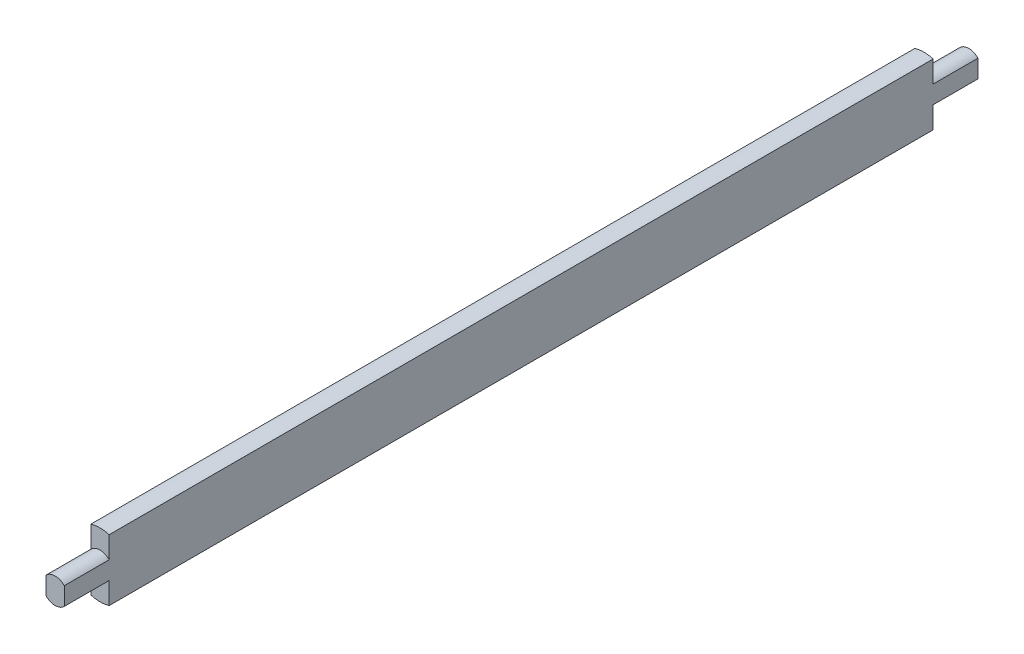
ISO-10303-21;
HEADER;
FILE_DESCRIPTION(('STEP AP214'),'2;1');
FILE_NAME('part.step','',(''),(''),'','','');
FILE_SCHEMA(('AUTOMOTIVE_DESIGN { 1 0 10303 214 1 1 1 1 }'));
ENDSEC;
DATA;
#1=APPLICATION_CONTEXT('core data for automotive mechanical design processes');
#2=APPLICATION_PROTOCOL_DEFINITION('international standard','automotive_design',2000,#1);
#3=PRODUCT_CONTEXT('',#1,'mechanical');
#4=PRODUCT('Part','Part','',(#3));
#5=PRODUCT_RELATED_PRODUCT_CATEGORY('part','',(#4));
#6=PRODUCT_DEFINITION_FORMATION('','',#4);
#7=PRODUCT_DEFINITION_CONTEXT('part definition',#1,'design');
#8=PRODUCT_DEFINITION('design','',#6,#7);
#9=PRODUCT_DEFINITION_SHAPE('','',#8);
#10=(LENGTH_UNIT() NAMED_UNIT(*) SI_UNIT(.MILLI.,.METRE.));
#11=(NAMED_UNIT(*) PLANE_ANGLE_UNIT() SI_UNIT($,.RADIAN.));
#12=(NAMED_UNIT(*) SI_UNIT($,.STERADIAN.) SOLID_ANGLE_UNIT());
#13=UNCERTAINTY_MEASURE_WITH_UNIT(LENGTH_MEASURE(1.E-05),#10,'distance_accuracy_value','');
#14=(GEOMETRIC_REPRESENTATION_CONTEXT(3) GLOBAL_UNCERTAINTY_ASSIGNED_CONTEXT((#13)) GLOBAL_UNIT_ASSIGNED_CONTEXT((#10,
#11,#12)) REPRESENTATION_CONTEXT('',''));
#15=CARTESIAN_POINT('',(0.,0.,0.));
#16=DIRECTION('',(0.,0.,1.));
#17=DIRECTION('',(1.,0.,0.));
#18=AXIS2_PLACEMENT_3D('',#15,#16,#17);
#19=CARTESIAN_POINT('',(0.,0.,90.));
#20=DIRECTION('',(0.,0.,-1.));
#21=DIRECTION('',(-1.,0.,0.));
#22=AXIS2_PLACEMENT_3D('',#19,#20,#21);
#23=CYLINDRICAL_SURFACE('',#22,3.5);
#24=CARTESIAN_POINT('',(0.,0.,90.));
#25=DIRECTION('',(0.,0.,1.));
#26=DIRECTION('',(1.,0.,0.));
#27=AXIS2_PLACEMENT_3D('',#24,#25,#26);
#28=CIRCLE('',#27,3.5);
#29=CARTESIAN_POINT('',(-0.999999999999999,-3.35410196624968,90.));
#30=VERTEX_POINT('',#29);
#31=CARTESIAN_POINT('',(1.,-3.35410196624968,90.));
#32=VERTEX_POINT('',#31);
#33=EDGE_CURVE('E162',#30,#32,#28,.T.);
#34=ORIENTED_EDGE('',*,*,#33,.F.);
#35=DIRECTION('',(0.,0.,-1.));
#36=VECTOR('',#35,1.);
#37=CARTESIAN_POINT('',(-0.999999999999999,-3.35410196624968,90.));
#38=LINE('',#37,#36);
#39=CARTESIAN_POINT('',(-0.999999999999999,-3.35410196624969,0.));
#40=VERTEX_POINT('',#39);
#41=EDGE_CURVE('E225',#30,#40,#38,.T.);
#42=ORIENTED_EDGE('',*,*,#41,.T.);
#43=CARTESIAN_POINT('',(0.,0.,0.));
#44=DIRECTION('',(0.,0.,1.));
#45=DIRECTION('',(1.,0.,0.));
#46=AXIS2_PLACEMENT_3D('',#43,#44,#45);
#47=CIRCLE('',#46,3.5);
#48=CARTESIAN_POINT('',(1.,-3.35410196624968,0.));
#49=VERTEX_POINT('',#48);
#50=EDGE_CURVE('E147',#40,#49,#47,.T.);
#51=ORIENTED_EDGE('',*,*,#50,.T.);
#52=DIRECTION('',(0.,0.,-1.));
#53=VECTOR('',#52,1.);
#54=CARTESIAN_POINT('',(1.,-3.35410196624968,90.));
#55=LINE('',#54,#53);
#56=EDGE_CURVE('E193',#49,#32,#55,.F.);
#57=ORIENTED_EDGE('',*,*,#56,.T.);
#58=EDGE_LOOP('',(#34,#42,#51,#57));
#59=FACE_BOUND('',#58,.T.);
#60=ADVANCED_FACE('F33',(#59),#23,.T.);
#61=CARTESIAN_POINT('',(0.,0.,90.));
#62=DIRECTION('',(0.,0.,1.));
#63=DIRECTION('',(1.,0.,0.));
#64=AXIS2_PLACEMENT_3D('',#61,#62,#63);
#65=PLANE('',#64);
#66=DIRECTION('',(0.,1.,0.));
#67=VECTOR('',#66,1.);
#68=CARTESIAN_POINT('',(-0.999999999999999,0.,90.));
#69=LINE('',#68,#67);
#70=CARTESIAN_POINT('',(-0.999999999999999,-0.979795897113272,90.));
#71=VERTEX_POINT('',#70);
#72=EDGE_CURVE('E126',#30,#71,#69,.T.);
#73=ORIENTED_EDGE('',*,*,#72,.F.);
#74=ORIENTED_EDGE('',*,*,#33,.T.);
#75=DIRECTION('',(0.,-1.,0.));
#76=VECTOR('',#75,1.);
#77=CARTESIAN_POINT('',(1.,0.,90.));
#78=LINE('',#77,#76);
#79=CARTESIAN_POINT('',(1.,-0.97979589711327,90.));
#80=VERTEX_POINT('',#79);
#81=EDGE_CURVE('E197',#80,#32,#78,.T.);
#82=ORIENTED_EDGE('',*,*,#81,.F.);
#83=CARTESIAN_POINT('',(0.,0.,90.));
#84=DIRECTION('',(0.,0.,1.));
#85=DIRECTION('',(1.,0.,0.));
#86=AXIS2_PLACEMENT_3D('',#83,#84,#85);
#87=CIRCLE('',#86,1.4);
#88=EDGE_CURVE('E158',#71,#80,#87,.T.);
#89=ORIENTED_EDGE('',*,*,#88,.F.);
#90=EDGE_LOOP('',(#73,#74,#82,#89));
#91=FACE_BOUND('',#90,.T.);
#92=ADVANCED_FACE('F245',(#91),#65,.T.);
#93=CARTESIAN_POINT('',(0.,0.,0.));
#94=DIRECTION('',(0.,0.,1.));
#95=DIRECTION('',(1.,0.,0.));
#96=AXIS2_PLACEMENT_3D('',#93,#94,#95);
#97=PLANE('',#96);
#98=ORIENTED_EDGE('',*,*,#50,.F.);
#99=DIRECTION('',(0.,1.,0.));
#100=VECTOR('',#99,1.);
#101=CARTESIAN_POINT('',(-0.999999999999999,0.,0.));
#102=LINE('',#101,#100);
#103=CARTESIAN_POINT('',(-0.999999999999999,-0.979795897113272,0.));
#104=VERTEX_POINT('',#103);
#105=EDGE_CURVE('E227',#40,#104,#102,.T.);
#106=ORIENTED_EDGE('',*,*,#105,.T.);
#107=CARTESIAN_POINT('',(0.,0.,0.));
#108=DIRECTION('',(0.,0.,-1.));
#109=DIRECTION('',(-1.,0.,0.));
#110=AXIS2_PLACEMENT_3D('',#107,#108,#109);
#111=CIRCLE('',#110,1.4);
#112=CARTESIAN_POINT('',(1.,-0.97979589711327,0.));
#113=VERTEX_POINT('',#112);
#114=EDGE_CURVE('E153',#113,#104,#111,.T.);
#115=ORIENTED_EDGE('',*,*,#114,.F.);
#116=DIRECTION('',(0.,-1.,0.));
#117=VECTOR('',#116,1.);
#118=CARTESIAN_POINT('',(1.,0.,0.));
#119=LINE('',#118,#117);
#120=EDGE_CURVE('E189',#113,#49,#119,.T.);
#121=ORIENTED_EDGE('',*,*,#120,.T.);
#122=EDGE_LOOP('',(#98,#106,#115,#121));
#123=FACE_BOUND('',#122,.T.);
#124=ADVANCED_FACE('F249',(#123),#97,.F.);
#125=CARTESIAN_POINT('',(0.,0.,94.9));
#126=DIRECTION('',(0.,0.,-1.));
#127=DIRECTION('',(-1.,0.,0.));
#128=AXIS2_PLACEMENT_3D('',#125,#126,#127);
#129=CYLINDRICAL_SURFACE('',#128,1.4);
#130=CARTESIAN_POINT('',(0.,0.,94.9));
#131=DIRECTION('',(0.,0.,1.));
#132=DIRECTION('',(1.,0.,0.));
#133=AXIS2_PLACEMENT_3D('',#130,#131,#132);
#134=CIRCLE('',#133,1.4);
#135=CARTESIAN_POINT('',(-0.999999999999999,-0.979795897113272,94.9));
#136=VERTEX_POINT('',#135);
#137=CARTESIAN_POINT('',(1.,-0.97979589711327,94.9));
#138=VERTEX_POINT('',#137);
#139=EDGE_CURVE('E135',#136,#138,#134,.T.);
#140=ORIENTED_EDGE('',*,*,#139,.F.);
#141=DIRECTION('',(0.,0.,-1.));
#142=VECTOR('',#141,1.);
#143=CARTESIAN_POINT('',(-0.999999999999999,-0.979795897113272,94.9));
#144=LINE('',#143,#142);
#145=EDGE_CURVE('E120',#136,#71,#144,.T.);
#146=ORIENTED_EDGE('',*,*,#145,.T.);
#147=ORIENTED_EDGE('',*,*,#88,.T.);
#148=DIRECTION('',(0.,0.,-1.));
#149=VECTOR('',#148,1.);
#150=CARTESIAN_POINT('',(1.,-0.97979589711327,94.9));
#151=LINE('',#150,#149);
#152=EDGE_CURVE('E144',#80,#138,#151,.F.);
#153=ORIENTED_EDGE('',*,*,#152,.T.);
#154=EDGE_LOOP('',(#140,#146,#147,#153));
#155=FACE_BOUND('',#154,.T.);
#156=ADVANCED_FACE('F142',(#155),#129,.T.);
#157=CARTESIAN_POINT('',(0.,0.,-4.9));
#158=DIRECTION('',(0.,0.,1.));
#159=DIRECTION('',(1.,0.,0.));
#160=AXIS2_PLACEMENT_3D('',#157,#158,#159);
#161=CYLINDRICAL_SURFACE('',#160,1.4);
#162=CARTESIAN_POINT('',(0.,0.,-4.9));
#163=DIRECTION('',(0.,0.,-1.));
#164=DIRECTION('',(-1.,0.,0.));
#165=AXIS2_PLACEMENT_3D('',#162,#163,#164);
#166=CIRCLE('',#165,1.4);
#167=CARTESIAN_POINT('',(-0.999999999999999,0.979795897113272,-4.9));
#168=VERTEX_POINT('',#167);
#169=CARTESIAN_POINT('',(1.,0.97979589711327,-4.9));
#170=VERTEX_POINT('',#169);
#171=EDGE_CURVE('E149',#168,#170,#166,.T.);
#172=ORIENTED_EDGE('',*,*,#171,.F.);
#173=DIRECTION('',(0.,0.,1.));
#174=VECTOR('',#173,1.);
#175=CARTESIAN_POINT('',(-0.999999999999999,0.979795897113272,-4.9));
#176=LINE('',#175,#174);
#177=CARTESIAN_POINT('',(-0.999999999999999,0.979795897113272,0.));
#178=VERTEX_POINT('',#177);
#179=EDGE_CURVE('E47',#168,#178,#176,.T.);
#180=ORIENTED_EDGE('',*,*,#179,.T.);
#181=CARTESIAN_POINT('',(1.,0.97979589711327,0.));
#182=VERTEX_POINT('',#181);
#183=EDGE_CURVE('E157',#178,#182,#111,.T.);
#184=ORIENTED_EDGE('',*,*,#183,.T.);
#185=DIRECTION('',(0.,0.,1.));
#186=VECTOR('',#185,1.);
#187=CARTESIAN_POINT('',(1.,0.97979589711327,-4.9));
#188=LINE('',#187,#186);
#189=EDGE_CURVE('E175',#182,#170,#188,.F.);
#190=ORIENTED_EDGE('',*,*,#189,.T.);
#191=EDGE_LOOP('',(#172,#180,#184,#190));
#192=FACE_BOUND('',#191,.T.);
#193=ADVANCED_FACE('F174',(#192),#161,.T.);
#194=CARTESIAN_POINT('',(1.,3.35410196624968,0.));
#195=VERTEX_POINT('',#194);
#196=CARTESIAN_POINT('',(-0.999999999999999,3.35410196624969,0.));
#197=VERTEX_POINT('',#196);
#198=EDGE_CURVE('E163',#195,#197,#47,.T.);
#199=ORIENTED_EDGE('',*,*,#198,.T.);
#200=DIRECTION('',(0.,0.,-1.));
#201=VECTOR('',#200,1.);
#202=CARTESIAN_POINT('',(-0.999999999999999,3.35410196624968,90.));
#203=LINE('',#202,#201);
#204=CARTESIAN_POINT('',(-0.999999999999999,3.35410196624968,90.));
#205=VERTEX_POINT('',#204);
#206=EDGE_CURVE('E219',#197,#205,#203,.F.);
#207=ORIENTED_EDGE('',*,*,#206,.T.);
#208=CARTESIAN_POINT('',(1.,3.35410196624968,90.));
#209=VERTEX_POINT('',#208);
#210=EDGE_CURVE('E159',#209,#205,#28,.T.);
#211=ORIENTED_EDGE('',*,*,#210,.F.);
#212=DIRECTION('',(0.,0.,-1.));
#213=VECTOR('',#212,1.);
#214=CARTESIAN_POINT('',(1.,3.35410196624968,90.));
#215=LINE('',#214,#213);
#216=EDGE_CURVE('E187',#209,#195,#215,.T.);
#217=ORIENTED_EDGE('',*,*,#216,.T.);
#218=EDGE_LOOP('',(#199,#207,#211,#217));
#219=FACE_BOUND('',#218,.T.);
#220=ADVANCED_FACE('F35',(#219),#23,.T.);
#221=CARTESIAN_POINT('',(-0.999999999999999,0.979795897113272,90.));
#222=VERTEX_POINT('',#221);
#223=EDGE_CURVE('E216',#222,#205,#69,.T.);
#224=ORIENTED_EDGE('',*,*,#223,.F.);
#225=CARTESIAN_POINT('',(1.,0.97979589711327,90.));
#226=VERTEX_POINT('',#225);
#227=EDGE_CURVE('E154',#226,#222,#87,.T.);
#228=ORIENTED_EDGE('',*,*,#227,.F.);
#229=EDGE_CURVE('E190',#209,#226,#78,.T.);
#230=ORIENTED_EDGE('',*,*,#229,.F.);
#231=ORIENTED_EDGE('',*,*,#210,.T.);
#232=EDGE_LOOP('',(#224,#228,#230,#231));
#233=FACE_BOUND('',#232,.T.);
#234=ADVANCED_FACE('F215',(#233),#65,.T.);
#235=ORIENTED_EDGE('',*,*,#183,.F.);
#236=EDGE_CURVE('E222',#178,#197,#102,.T.);
#237=ORIENTED_EDGE('',*,*,#236,.T.);
#238=ORIENTED_EDGE('',*,*,#198,.F.);
#239=EDGE_CURVE('E181',#195,#182,#119,.T.);
#240=ORIENTED_EDGE('',*,*,#239,.T.);
#241=EDGE_LOOP('',(#235,#237,#238,#240));
#242=FACE_BOUND('',#241,.T.);
#243=ADVANCED_FACE('F186',(#242),#97,.F.);
#244=ORIENTED_EDGE('',*,*,#227,.T.);
#245=DIRECTION('',(0.,0.,-1.));
#246=VECTOR('',#245,1.);
#247=CARTESIAN_POINT('',(-0.999999999999999,0.979795897113272,94.9));
#248=LINE('',#247,#246);
#249=CARTESIAN_POINT('',(-0.999999999999999,0.979795897113272,94.9));
#250=VERTEX_POINT('',#249);
#251=EDGE_CURVE('E218',#222,#250,#248,.F.);
#252=ORIENTED_EDGE('',*,*,#251,.T.);
#253=CARTESIAN_POINT('',(1.,0.97979589711327,94.9));
#254=VERTEX_POINT('',#253);
#255=EDGE_CURVE('E138',#254,#250,#134,.T.);
#256=ORIENTED_EDGE('',*,*,#255,.F.);
#257=DIRECTION('',(0.,0.,-1.));
#258=VECTOR('',#257,1.);
#259=CARTESIAN_POINT('',(1.,0.97979589711327,94.9));
#260=LINE('',#259,#258);
#261=EDGE_CURVE('E199',#254,#226,#260,.T.);
#262=ORIENTED_EDGE('',*,*,#261,.T.);
#263=EDGE_LOOP('',(#244,#252,#256,#262));
#264=FACE_BOUND('',#263,.T.);
#265=ADVANCED_FACE('F213',(#264),#129,.T.);
#266=CARTESIAN_POINT('',(0.,0.,94.9));
#267=DIRECTION('',(0.,0.,1.));
#268=DIRECTION('',(1.,0.,0.));
#269=AXIS2_PLACEMENT_3D('',#266,#267,#268);
#270=PLANE('',#269);
#271=DIRECTION('',(0.,1.,0.));
#272=VECTOR('',#271,1.);
#273=CARTESIAN_POINT('',(-0.999999999999999,-4.13546057951414,94.9));
#274=LINE('',#273,#272);
#275=EDGE_CURVE('E123',#136,#250,#274,.T.);
#276=ORIENTED_EDGE('',*,*,#275,.F.);
#277=ORIENTED_EDGE('',*,*,#139,.T.);
#278=DIRECTION('',(0.,-1.,0.));
#279=VECTOR('',#278,1.);
#280=CARTESIAN_POINT('',(1.,-4.13546057951414,94.9));
#281=LINE('',#280,#279);
#282=EDGE_CURVE('E183',#254,#138,#281,.T.);
#283=ORIENTED_EDGE('',*,*,#282,.F.);
#284=ORIENTED_EDGE('',*,*,#255,.T.);
#285=EDGE_LOOP('',(#276,#277,#283,#284));
#286=FACE_BOUND('',#285,.T.);
#287=ADVANCED_FACE('F133',(#286),#270,.T.);
#288=ORIENTED_EDGE('',*,*,#114,.T.);
#289=DIRECTION('',(0.,0.,1.));
#290=VECTOR('',#289,1.);
#291=CARTESIAN_POINT('',(-0.999999999999999,-0.979795897113272,-4.9));
#292=LINE('',#291,#290);
#293=CARTESIAN_POINT('',(-0.999999999999999,-0.979795897113272,-4.9));
#294=VERTEX_POINT('',#293);
#295=EDGE_CURVE('E139',#104,#294,#292,.F.);
#296=ORIENTED_EDGE('',*,*,#295,.T.);
#297=CARTESIAN_POINT('',(1.,-0.97979589711327,-4.9));
#298=VERTEX_POINT('',#297);
#299=EDGE_CURVE('E145',#298,#294,#166,.T.);
#300=ORIENTED_EDGE('',*,*,#299,.F.);
#301=DIRECTION('',(0.,0.,1.));
#302=VECTOR('',#301,1.);
#303=CARTESIAN_POINT('',(1.,-0.97979589711327,-4.9));
#304=LINE('',#303,#302);
#305=EDGE_CURVE('E55',#298,#113,#304,.T.);
#306=ORIENTED_EDGE('',*,*,#305,.T.);
#307=EDGE_LOOP('',(#288,#296,#300,#306));
#308=FACE_BOUND('',#307,.T.);
#309=ADVANCED_FACE('F233',(#308),#161,.T.);
#310=CARTESIAN_POINT('',(0.,0.,-4.9));
#311=DIRECTION('',(0.,0.,-1.));
#312=DIRECTION('',(-1.,0.,0.));
#313=AXIS2_PLACEMENT_3D('',#310,#311,#312);
#314=PLANE('',#313);
#315=DIRECTION('',(0.,-1.,0.));
#316=VECTOR('',#315,1.);
#317=CARTESIAN_POINT('',(-0.999999999999999,0.,-4.9));
#318=LINE('',#317,#316);
#319=EDGE_CURVE('E11',#168,#294,#318,.T.);
#320=ORIENTED_EDGE('',*,*,#319,.F.);
#321=ORIENTED_EDGE('',*,*,#171,.T.);
#322=DIRECTION('',(0.,1.,0.));
#323=VECTOR('',#322,1.);
#324=CARTESIAN_POINT('',(1.,0.,-4.9));
#325=LINE('',#324,#323);
#326=EDGE_CURVE('E41',#298,#170,#325,.T.);
#327=ORIENTED_EDGE('',*,*,#326,.F.);
#328=ORIENTED_EDGE('',*,*,#299,.T.);
#329=EDGE_LOOP('',(#320,#321,#327,#328));
#330=FACE_BOUND('',#329,.T.);
#331=ADVANCED_FACE('F235',(#330),#314,.T.);
#332=CARTESIAN_POINT('',(1.,-4.13546057951414,-4.9));
#333=DIRECTION('',(-1.,0.,0.));
#334=DIRECTION('',(0.,0.,1.));
#335=AXIS2_PLACEMENT_3D('',#332,#333,#334);
#336=PLANE('',#335);
#337=ORIENTED_EDGE('',*,*,#81,.T.);
#338=ORIENTED_EDGE('',*,*,#56,.F.);
#339=ORIENTED_EDGE('',*,*,#120,.F.);
#340=ORIENTED_EDGE('',*,*,#305,.F.);
#341=ORIENTED_EDGE('',*,*,#326,.T.);
#342=ORIENTED_EDGE('',*,*,#189,.F.);
#343=ORIENTED_EDGE('',*,*,#239,.F.);
#344=ORIENTED_EDGE('',*,*,#216,.F.);
#345=ORIENTED_EDGE('',*,*,#229,.T.);
#346=ORIENTED_EDGE('',*,*,#261,.F.);
#347=ORIENTED_EDGE('',*,*,#282,.T.);
#348=ORIENTED_EDGE('',*,*,#152,.F.);
#349=EDGE_LOOP('',(#337,#338,#339,#340,#341,#342,#343,#344,#345,#346,#347,#348));
#350=FACE_BOUND('',#349,.T.);
#351=ADVANCED_FACE('F180',(#350),#336,.F.);
#352=CARTESIAN_POINT('',(-0.999999999999999,-4.13546057951414,-4.9));
#353=DIRECTION('',(1.,0.,0.));
#354=DIRECTION('',(0.,0.,-1.));
#355=AXIS2_PLACEMENT_3D('',#352,#353,#354);
#356=PLANE('',#355);
#357=ORIENTED_EDGE('',*,*,#223,.T.);
#358=ORIENTED_EDGE('',*,*,#206,.F.);
#359=ORIENTED_EDGE('',*,*,#236,.F.);
#360=ORIENTED_EDGE('',*,*,#179,.F.);
#361=ORIENTED_EDGE('',*,*,#319,.T.);
#362=ORIENTED_EDGE('',*,*,#295,.F.);
#363=ORIENTED_EDGE('',*,*,#105,.F.);
#364=ORIENTED_EDGE('',*,*,#41,.F.);
#365=ORIENTED_EDGE('',*,*,#72,.T.);
#366=ORIENTED_EDGE('',*,*,#145,.F.);
#367=ORIENTED_EDGE('',*,*,#275,.T.);
#368=ORIENTED_EDGE('',*,*,#251,.F.);
#369=EDGE_LOOP('',(#357,#358,#359,#360,#361,#362,#363,#364,#365,#366,#367,#368));
#370=FACE_BOUND('',#369,.T.);
#371=ADVANCED_FACE('F122',(#370),#356,.F.);
#372=CLOSED_SHELL('',(#60,#92,#124,#156,#193,#220,#234,#243,#265,#287,#309,#331,#351,#371));
#373=MANIFOLD_SOLID_BREP('B2',#372);
#374=ADVANCED_BREP_SHAPE_REPRESENTATION('',(#18,#373),#14);
#375=SHAPE_DEFINITION_REPRESENTATION(#9,#374);
ENDSEC;
END-ISO-10303-21;
